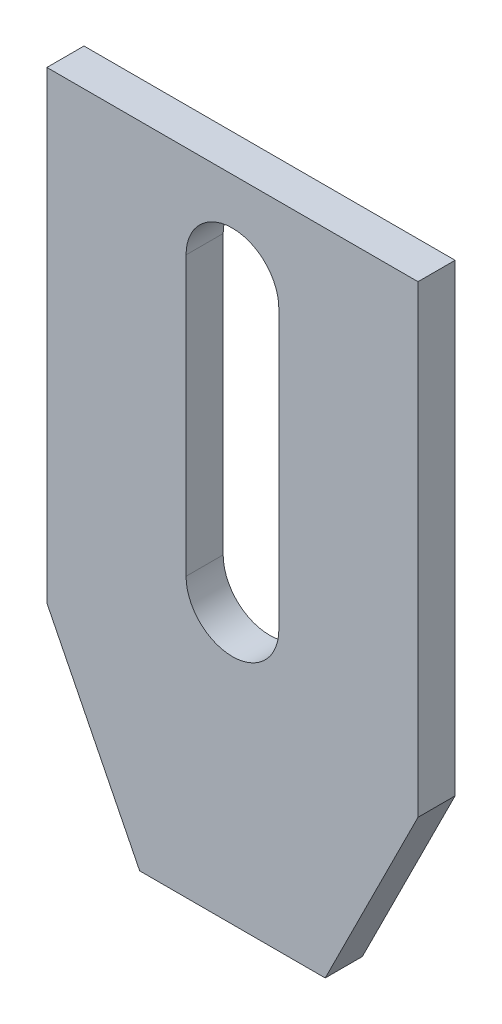
ISO-10303-21;
HEADER;
FILE_DESCRIPTION(('STEP AP214'),'2;1');
FILE_NAME('part.step','',(''),(''),'','','');
FILE_SCHEMA(('AUTOMOTIVE_DESIGN { 1 0 10303 214 1 1 1 1 }'));
ENDSEC;
DATA;
#1=APPLICATION_CONTEXT('core data for automotive mechanical design processes');
#2=APPLICATION_PROTOCOL_DEFINITION('international standard','automotive_design',2000,#1);
#3=PRODUCT_CONTEXT('',#1,'mechanical');
#4=PRODUCT('Part','Part','',(#3));
#5=PRODUCT_RELATED_PRODUCT_CATEGORY('part','',(#4));
#6=PRODUCT_DEFINITION_FORMATION('','',#4);
#7=PRODUCT_DEFINITION_CONTEXT('part definition',#1,'design');
#8=PRODUCT_DEFINITION('design','',#6,#7);
#9=PRODUCT_DEFINITION_SHAPE('','',#8);
#10=(LENGTH_UNIT() NAMED_UNIT(*) SI_UNIT(.MILLI.,.METRE.));
#11=(NAMED_UNIT(*) PLANE_ANGLE_UNIT() SI_UNIT($,.RADIAN.));
#12=(NAMED_UNIT(*) SI_UNIT($,.STERADIAN.) SOLID_ANGLE_UNIT());
#13=UNCERTAINTY_MEASURE_WITH_UNIT(LENGTH_MEASURE(1.E-05),#10,'distance_accuracy_value','');
#14=(GEOMETRIC_REPRESENTATION_CONTEXT(3) GLOBAL_UNCERTAINTY_ASSIGNED_CONTEXT((#13)) GLOBAL_UNIT_ASSIGNED_CONTEXT((#10,
#11,#12)) REPRESENTATION_CONTEXT('',''));
#15=CARTESIAN_POINT('',(0.,0.,0.));
#16=DIRECTION('',(0.,0.,1.));
#17=DIRECTION('',(1.,0.,0.));
#18=AXIS2_PLACEMENT_3D('',#15,#16,#17);
#19=CARTESIAN_POINT('',(0.,0.,4.));
#20=DIRECTION('',(0.,0.,1.));
#21=DIRECTION('',(1.,0.,0.));
#22=AXIS2_PLACEMENT_3D('',#19,#20,#21);
#23=PLANE('',#22);
#24=DIRECTION('',(0.,1.,0.));
#25=VECTOR('',#24,1.);
#26=CARTESIAN_POINT('',(17.9473684210527,-5.78947368421052,4.));
#27=LINE('',#26,#25);
#28=CARTESIAN_POINT('',(17.9473684210527,-5.78947368421052,4.));
#29=VERTEX_POINT('',#28);
#30=CARTESIAN_POINT('',(17.9473684210527,44.2105263157895,4.));
#31=VERTEX_POINT('',#30);
#32=EDGE_CURVE('E146',#29,#31,#27,.T.);
#33=ORIENTED_EDGE('',*,*,#32,.T.);
#34=DIRECTION('',(-1.,0.,0.));
#35=VECTOR('',#34,1.);
#36=CARTESIAN_POINT('',(17.9473684210527,44.2105263157895,4.));
#37=LINE('',#36,#35);
#38=CARTESIAN_POINT('',(-22.0526315789473,44.2105263157895,4.));
#39=VERTEX_POINT('',#38);
#40=EDGE_CURVE('E149',#31,#39,#37,.T.);
#41=ORIENTED_EDGE('',*,*,#40,.T.);
#42=DIRECTION('',(0.,-1.,0.));
#43=VECTOR('',#42,1.);
#44=CARTESIAN_POINT('',(-22.0526315789473,44.2105263157895,4.));
#45=LINE('',#44,#43);
#46=CARTESIAN_POINT('',(-22.0526315789473,-5.78947368421052,4.));
#47=VERTEX_POINT('',#46);
#48=EDGE_CURVE('E152',#39,#47,#45,.T.);
#49=ORIENTED_EDGE('',*,*,#48,.T.);
#50=DIRECTION('',(0.447213595499958,-0.894427190999916,0.));
#51=VECTOR('',#50,1.);
#52=CARTESIAN_POINT('',(-22.0526315789473,-5.78947368421052,4.));
#53=LINE('',#52,#51);
#54=CARTESIAN_POINT('',(-12.0526315789473,-25.7894736842105,4.));
#55=VERTEX_POINT('',#54);
#56=EDGE_CURVE('E154',#47,#55,#53,.T.);
#57=ORIENTED_EDGE('',*,*,#56,.T.);
#58=DIRECTION('',(1.,0.,0.));
#59=VECTOR('',#58,1.);
#60=CARTESIAN_POINT('',(-12.0526315789473,-25.7894736842105,4.));
#61=LINE('',#60,#59);
#62=CARTESIAN_POINT('',(7.94736842105266,-25.7894736842105,4.));
#63=VERTEX_POINT('',#62);
#64=EDGE_CURVE('E156',#55,#63,#61,.T.);
#65=ORIENTED_EDGE('',*,*,#64,.T.);
#66=DIRECTION('',(0.447213595499958,0.894427190999916,0.));
#67=VECTOR('',#66,1.);
#68=CARTESIAN_POINT('',(7.94736842105266,-25.7894736842105,4.));
#69=LINE('',#68,#67);
#70=EDGE_CURVE('E158',#63,#29,#69,.T.);
#71=ORIENTED_EDGE('',*,*,#70,.T.);
#72=EDGE_LOOP('',(#33,#41,#49,#57,#65,#71));
#73=FACE_BOUND('',#72,.T.);
#74=DIRECTION('',(0.,-1.,0.));
#75=VECTOR('',#74,1.);
#76=CARTESIAN_POINT('',(-7.05263157894737,34.2105263157895,4.));
#77=LINE('',#76,#75);
#78=CARTESIAN_POINT('',(-7.05263157894737,34.2105263157895,4.));
#79=VERTEX_POINT('',#78);
#80=CARTESIAN_POINT('',(-7.05263157894736,4.21052631578948,4.));
#81=VERTEX_POINT('',#80);
#82=EDGE_CURVE('E118',#79,#81,#77,.T.);
#83=ORIENTED_EDGE('',*,*,#82,.F.);
#84=CARTESIAN_POINT('',(-2.05263157894737,34.2105263157895,4.));
#85=DIRECTION('',(0.,0.,1.));
#86=DIRECTION('',(1.,0.,0.));
#87=AXIS2_PLACEMENT_3D('',#84,#85,#86);
#88=CIRCLE('',#87,5.);
#89=CARTESIAN_POINT('',(2.94736842105264,34.2105263157895,4.));
#90=VERTEX_POINT('',#89);
#91=EDGE_CURVE('E110',#90,#79,#88,.T.);
#92=ORIENTED_EDGE('',*,*,#91,.F.);
#93=DIRECTION('',(0.,1.,0.));
#94=VECTOR('',#93,1.);
#95=CARTESIAN_POINT('',(2.94736842105264,34.2105263157895,4.));
#96=LINE('',#95,#94);
#97=CARTESIAN_POINT('',(2.94736842105264,4.21052631578948,4.));
#98=VERTEX_POINT('',#97);
#99=EDGE_CURVE('E132',#98,#90,#96,.T.);
#100=ORIENTED_EDGE('',*,*,#99,.F.);
#101=CARTESIAN_POINT('',(-2.05263157894736,4.21052631578948,4.));
#102=DIRECTION('',(0.,0.,1.));
#103=DIRECTION('',(1.,0.,0.));
#104=AXIS2_PLACEMENT_3D('',#101,#102,#103);
#105=CIRCLE('',#104,5.);
#106=EDGE_CURVE('E130',#81,#98,#105,.T.);
#107=ORIENTED_EDGE('',*,*,#106,.F.);
#108=EDGE_LOOP('',(#83,#92,#100,#107));
#109=FACE_BOUND('',#108,.T.);
#110=ADVANCED_FACE('F33',(#73,#109),#23,.T.);
#111=CARTESIAN_POINT('',(0.,0.,0.));
#112=DIRECTION('',(0.,0.,1.));
#113=DIRECTION('',(1.,0.,0.));
#114=AXIS2_PLACEMENT_3D('',#111,#112,#113);
#115=PLANE('',#114);
#116=DIRECTION('',(0.,1.,0.));
#117=VECTOR('',#116,1.);
#118=CARTESIAN_POINT('',(17.9473684210527,-5.78947368421052,0.));
#119=LINE('',#118,#117);
#120=CARTESIAN_POINT('',(17.9473684210527,-5.78947368421052,0.));
#121=VERTEX_POINT('',#120);
#122=CARTESIAN_POINT('',(17.9473684210527,44.2105263157895,0.));
#123=VERTEX_POINT('',#122);
#124=EDGE_CURVE('E126',#121,#123,#119,.T.);
#125=ORIENTED_EDGE('',*,*,#124,.F.);
#126=DIRECTION('',(0.447213595499958,0.894427190999916,0.));
#127=VECTOR('',#126,1.);
#128=CARTESIAN_POINT('',(7.94736842105266,-25.7894736842105,0.));
#129=LINE('',#128,#127);
#130=CARTESIAN_POINT('',(7.94736842105266,-25.7894736842105,0.));
#131=VERTEX_POINT('',#130);
#132=EDGE_CURVE('E150',#131,#121,#129,.T.);
#133=ORIENTED_EDGE('',*,*,#132,.F.);
#134=DIRECTION('',(1.,0.,0.));
#135=VECTOR('',#134,1.);
#136=CARTESIAN_POINT('',(-12.0526315789473,-25.7894736842105,0.));
#137=LINE('',#136,#135);
#138=CARTESIAN_POINT('',(-12.0526315789473,-25.7894736842105,0.));
#139=VERTEX_POINT('',#138);
#140=EDGE_CURVE('E169',#139,#131,#137,.T.);
#141=ORIENTED_EDGE('',*,*,#140,.F.);
#142=DIRECTION('',(0.447213595499958,-0.894427190999916,0.));
#143=VECTOR('',#142,1.);
#144=CARTESIAN_POINT('',(-22.0526315789473,-5.78947368421052,0.));
#145=LINE('',#144,#143);
#146=CARTESIAN_POINT('',(-22.0526315789473,-5.78947368421052,0.));
#147=VERTEX_POINT('',#146);
#148=EDGE_CURVE('E167',#147,#139,#145,.T.);
#149=ORIENTED_EDGE('',*,*,#148,.F.);
#150=DIRECTION('',(0.,-1.,0.));
#151=VECTOR('',#150,1.);
#152=CARTESIAN_POINT('',(-22.0526315789473,44.2105263157895,0.));
#153=LINE('',#152,#151);
#154=CARTESIAN_POINT('',(-22.0526315789473,44.2105263157895,0.));
#155=VERTEX_POINT('',#154);
#156=EDGE_CURVE('E165',#155,#147,#153,.T.);
#157=ORIENTED_EDGE('',*,*,#156,.F.);
#158=DIRECTION('',(-1.,0.,0.));
#159=VECTOR('',#158,1.);
#160=CARTESIAN_POINT('',(17.9473684210527,44.2105263157895,0.));
#161=LINE('',#160,#159);
#162=EDGE_CURVE('E163',#123,#155,#161,.T.);
#163=ORIENTED_EDGE('',*,*,#162,.F.);
#164=EDGE_LOOP('',(#125,#133,#141,#149,#157,#163));
#165=FACE_BOUND('',#164,.T.);
#166=CARTESIAN_POINT('',(-2.05263157894737,34.2105263157895,0.));
#167=DIRECTION('',(0.,0.,1.));
#168=DIRECTION('',(1.,0.,0.));
#169=AXIS2_PLACEMENT_3D('',#166,#167,#168);
#170=CIRCLE('',#169,5.);
#171=CARTESIAN_POINT('',(2.94736842105264,34.2105263157895,0.));
#172=VERTEX_POINT('',#171);
#173=CARTESIAN_POINT('',(-7.05263157894737,34.2105263157895,0.));
#174=VERTEX_POINT('',#173);
#175=EDGE_CURVE('E56',#172,#174,#170,.T.);
#176=ORIENTED_EDGE('',*,*,#175,.T.);
#177=DIRECTION('',(0.,-1.,0.));
#178=VECTOR('',#177,1.);
#179=CARTESIAN_POINT('',(-7.05263157894737,34.2105263157895,0.));
#180=LINE('',#179,#178);
#181=CARTESIAN_POINT('',(-7.05263157894736,4.21052631578948,0.));
#182=VERTEX_POINT('',#181);
#183=EDGE_CURVE('E125',#174,#182,#180,.T.);
#184=ORIENTED_EDGE('',*,*,#183,.T.);
#185=CARTESIAN_POINT('',(-2.05263157894736,4.21052631578948,0.));
#186=DIRECTION('',(0.,0.,1.));
#187=DIRECTION('',(1.,0.,0.));
#188=AXIS2_PLACEMENT_3D('',#185,#186,#187);
#189=CIRCLE('',#188,5.);
#190=CARTESIAN_POINT('',(2.94736842105264,4.21052631578948,0.));
#191=VERTEX_POINT('',#190);
#192=EDGE_CURVE('E138',#182,#191,#189,.T.);
#193=ORIENTED_EDGE('',*,*,#192,.T.);
#194=DIRECTION('',(0.,1.,0.));
#195=VECTOR('',#194,1.);
#196=CARTESIAN_POINT('',(2.94736842105264,34.2105263157895,0.));
#197=LINE('',#196,#195);
#198=EDGE_CURVE('E119',#191,#172,#197,.T.);
#199=ORIENTED_EDGE('',*,*,#198,.T.);
#200=EDGE_LOOP('',(#176,#184,#193,#199));
#201=FACE_BOUND('',#200,.T.);
#202=ADVANCED_FACE('F193',(#165,#201),#115,.F.);
#203=CARTESIAN_POINT('',(17.9473684210527,-5.78947368421052,4.));
#204=DIRECTION('',(-1.,0.,0.));
#205=DIRECTION('',(0.,0.,1.));
#206=AXIS2_PLACEMENT_3D('',#203,#204,#205);
#207=PLANE('',#206);
#208=ORIENTED_EDGE('',*,*,#124,.T.);
#209=DIRECTION('',(0.,0.,-1.));
#210=VECTOR('',#209,1.);
#211=CARTESIAN_POINT('',(17.9473684210527,44.2105263157895,4.));
#212=LINE('',#211,#210);
#213=EDGE_CURVE('E11',#31,#123,#212,.T.);
#214=ORIENTED_EDGE('',*,*,#213,.F.);
#215=ORIENTED_EDGE('',*,*,#32,.F.);
#216=DIRECTION('',(0.,0.,-1.));
#217=VECTOR('',#216,1.);
#218=CARTESIAN_POINT('',(17.9473684210527,-5.78947368421052,4.));
#219=LINE('',#218,#217);
#220=EDGE_CURVE('E160',#29,#121,#219,.T.);
#221=ORIENTED_EDGE('',*,*,#220,.T.);
#222=EDGE_LOOP('',(#208,#214,#215,#221));
#223=FACE_BOUND('',#222,.T.);
#224=ADVANCED_FACE('F35',(#223),#207,.F.);
#225=CARTESIAN_POINT('',(17.9473684210527,44.2105263157895,4.));
#226=DIRECTION('',(0.,-1.,0.));
#227=DIRECTION('',(0.,0.,-1.));
#228=AXIS2_PLACEMENT_3D('',#225,#226,#227);
#229=PLANE('',#228);
#230=ORIENTED_EDGE('',*,*,#162,.T.);
#231=DIRECTION('',(0.,0.,-1.));
#232=VECTOR('',#231,1.);
#233=CARTESIAN_POINT('',(-22.0526315789473,44.2105263157895,4.));
#234=LINE('',#233,#232);
#235=EDGE_CURVE('E41',#39,#155,#234,.T.);
#236=ORIENTED_EDGE('',*,*,#235,.F.);
#237=ORIENTED_EDGE('',*,*,#40,.F.);
#238=ORIENTED_EDGE('',*,*,#213,.T.);
#239=EDGE_LOOP('',(#230,#236,#237,#238));
#240=FACE_BOUND('',#239,.T.);
#241=ADVANCED_FACE('F210',(#240),#229,.F.);
#242=CARTESIAN_POINT('',(-22.0526315789473,44.2105263157895,4.));
#243=DIRECTION('',(1.,0.,0.));
#244=DIRECTION('',(0.,0.,-1.));
#245=AXIS2_PLACEMENT_3D('',#242,#243,#244);
#246=PLANE('',#245);
#247=ORIENTED_EDGE('',*,*,#156,.T.);
#248=DIRECTION('',(0.,0.,-1.));
#249=VECTOR('',#248,1.);
#250=CARTESIAN_POINT('',(-22.0526315789473,-5.78947368421052,4.));
#251=LINE('',#250,#249);
#252=EDGE_CURVE('E180',#47,#147,#251,.T.);
#253=ORIENTED_EDGE('',*,*,#252,.F.);
#254=ORIENTED_EDGE('',*,*,#48,.F.);
#255=ORIENTED_EDGE('',*,*,#235,.T.);
#256=EDGE_LOOP('',(#247,#253,#254,#255));
#257=FACE_BOUND('',#256,.T.);
#258=ADVANCED_FACE('F187',(#257),#246,.F.);
#259=CARTESIAN_POINT('',(-22.0526315789473,-5.78947368421052,4.));
#260=DIRECTION('',(0.894427190999916,0.447213595499958,0.));
#261=DIRECTION('',(-0.447213595499958,0.894427190999916,0.));
#262=AXIS2_PLACEMENT_3D('',#259,#260,#261);
#263=PLANE('',#262);
#264=ORIENTED_EDGE('',*,*,#148,.T.);
#265=DIRECTION('',(0.,0.,-1.));
#266=VECTOR('',#265,1.);
#267=CARTESIAN_POINT('',(-12.0526315789473,-25.7894736842105,4.));
#268=LINE('',#267,#266);
#269=EDGE_CURVE('E177',#55,#139,#268,.T.);
#270=ORIENTED_EDGE('',*,*,#269,.F.);
#271=ORIENTED_EDGE('',*,*,#56,.F.);
#272=ORIENTED_EDGE('',*,*,#252,.T.);
#273=EDGE_LOOP('',(#264,#270,#271,#272));
#274=FACE_BOUND('',#273,.T.);
#275=ADVANCED_FACE('F199',(#274),#263,.F.);
#276=CARTESIAN_POINT('',(-12.0526315789473,-25.7894736842105,4.));
#277=DIRECTION('',(0.,1.,0.));
#278=DIRECTION('',(0.,0.,1.));
#279=AXIS2_PLACEMENT_3D('',#276,#277,#278);
#280=PLANE('',#279);
#281=ORIENTED_EDGE('',*,*,#140,.T.);
#282=DIRECTION('',(0.,0.,-1.));
#283=VECTOR('',#282,1.);
#284=CARTESIAN_POINT('',(7.94736842105266,-25.7894736842105,4.));
#285=LINE('',#284,#283);
#286=EDGE_CURVE('E174',#63,#131,#285,.T.);
#287=ORIENTED_EDGE('',*,*,#286,.F.);
#288=ORIENTED_EDGE('',*,*,#64,.F.);
#289=ORIENTED_EDGE('',*,*,#269,.T.);
#290=EDGE_LOOP('',(#281,#287,#288,#289));
#291=FACE_BOUND('',#290,.T.);
#292=ADVANCED_FACE('F203',(#291),#280,.F.);
#293=CARTESIAN_POINT('',(7.94736842105266,-25.7894736842105,4.));
#294=DIRECTION('',(-0.894427190999916,0.447213595499958,0.));
#295=DIRECTION('',(-0.447213595499958,-0.894427190999916,0.));
#296=AXIS2_PLACEMENT_3D('',#293,#294,#295);
#297=PLANE('',#296);
#298=ORIENTED_EDGE('',*,*,#132,.T.);
#299=ORIENTED_EDGE('',*,*,#220,.F.);
#300=ORIENTED_EDGE('',*,*,#70,.F.);
#301=ORIENTED_EDGE('',*,*,#286,.T.);
#302=EDGE_LOOP('',(#298,#299,#300,#301));
#303=FACE_BOUND('',#302,.T.);
#304=ADVANCED_FACE('F213',(#303),#297,.F.);
#305=CARTESIAN_POINT('',(-2.05263157894737,34.2105263157895,4.));
#306=DIRECTION('',(0.,0.,-1.));
#307=DIRECTION('',(-1.,0.,0.));
#308=AXIS2_PLACEMENT_3D('',#305,#306,#307);
#309=CYLINDRICAL_SURFACE('',#308,5.);
#310=ORIENTED_EDGE('',*,*,#175,.F.);
#311=DIRECTION('',(0.,0.,-1.));
#312=VECTOR('',#311,1.);
#313=CARTESIAN_POINT('',(2.94736842105264,34.2105263157895,4.));
#314=LINE('',#313,#312);
#315=EDGE_CURVE('E114',#90,#172,#314,.T.);
#316=ORIENTED_EDGE('',*,*,#315,.F.);
#317=ORIENTED_EDGE('',*,*,#91,.T.);
#318=DIRECTION('',(0.,0.,-1.));
#319=VECTOR('',#318,1.);
#320=CARTESIAN_POINT('',(-7.05263157894737,34.2105263157895,4.));
#321=LINE('',#320,#319);
#322=EDGE_CURVE('E113',#79,#174,#321,.T.);
#323=ORIENTED_EDGE('',*,*,#322,.T.);
#324=EDGE_LOOP('',(#310,#316,#317,#323));
#325=FACE_BOUND('',#324,.T.);
#326=ADVANCED_FACE('F112',(#325),#309,.F.);
#327=CARTESIAN_POINT('',(-7.05263157894737,34.2105263157895,4.));
#328=DIRECTION('',(1.,0.,0.));
#329=DIRECTION('',(0.,1.,0.));
#330=AXIS2_PLACEMENT_3D('',#327,#328,#329);
#331=PLANE('',#330);
#332=ORIENTED_EDGE('',*,*,#183,.F.);
#333=ORIENTED_EDGE('',*,*,#322,.F.);
#334=ORIENTED_EDGE('',*,*,#82,.T.);
#335=DIRECTION('',(0.,0.,-1.));
#336=VECTOR('',#335,1.);
#337=CARTESIAN_POINT('',(-7.05263157894736,4.21052631578948,4.));
#338=LINE('',#337,#336);
#339=EDGE_CURVE('E127',#81,#182,#338,.T.);
#340=ORIENTED_EDGE('',*,*,#339,.T.);
#341=EDGE_LOOP('',(#332,#333,#334,#340));
#342=FACE_BOUND('',#341,.T.);
#343=ADVANCED_FACE('F122',(#342),#331,.T.);
#344=CARTESIAN_POINT('',(-2.05263157894736,4.21052631578948,4.));
#345=DIRECTION('',(0.,0.,-1.));
#346=DIRECTION('',(-1.,0.,0.));
#347=AXIS2_PLACEMENT_3D('',#344,#345,#346);
#348=CYLINDRICAL_SURFACE('',#347,5.);
#349=ORIENTED_EDGE('',*,*,#192,.F.);
#350=ORIENTED_EDGE('',*,*,#339,.F.);
#351=ORIENTED_EDGE('',*,*,#106,.T.);
#352=DIRECTION('',(0.,0.,-1.));
#353=VECTOR('',#352,1.);
#354=CARTESIAN_POINT('',(2.94736842105264,4.21052631578948,4.));
#355=LINE('',#354,#353);
#356=EDGE_CURVE('E48',#98,#191,#355,.T.);
#357=ORIENTED_EDGE('',*,*,#356,.T.);
#358=EDGE_LOOP('',(#349,#350,#351,#357));
#359=FACE_BOUND('',#358,.T.);
#360=ADVANCED_FACE('F231',(#359),#348,.F.);
#361=CARTESIAN_POINT('',(2.94736842105264,34.2105263157895,4.));
#362=DIRECTION('',(-1.,0.,0.));
#363=DIRECTION('',(0.,-1.,0.));
#364=AXIS2_PLACEMENT_3D('',#361,#362,#363);
#365=PLANE('',#364);
#366=ORIENTED_EDGE('',*,*,#198,.F.);
#367=ORIENTED_EDGE('',*,*,#356,.F.);
#368=ORIENTED_EDGE('',*,*,#99,.T.);
#369=ORIENTED_EDGE('',*,*,#315,.T.);
#370=EDGE_LOOP('',(#366,#367,#368,#369));
#371=FACE_BOUND('',#370,.T.);
#372=ADVANCED_FACE('F234',(#371),#365,.T.);
#373=CLOSED_SHELL('',(#110,#202,#224,#241,#258,#275,#292,#304,#326,#343,#360,#372));
#374=MANIFOLD_SOLID_BREP('B2',#373);
#375=ADVANCED_BREP_SHAPE_REPRESENTATION('',(#18,#374),#14);
#376=SHAPE_DEFINITION_REPRESENTATION(#9,#375);
ENDSEC;
END-ISO-10303-21;
